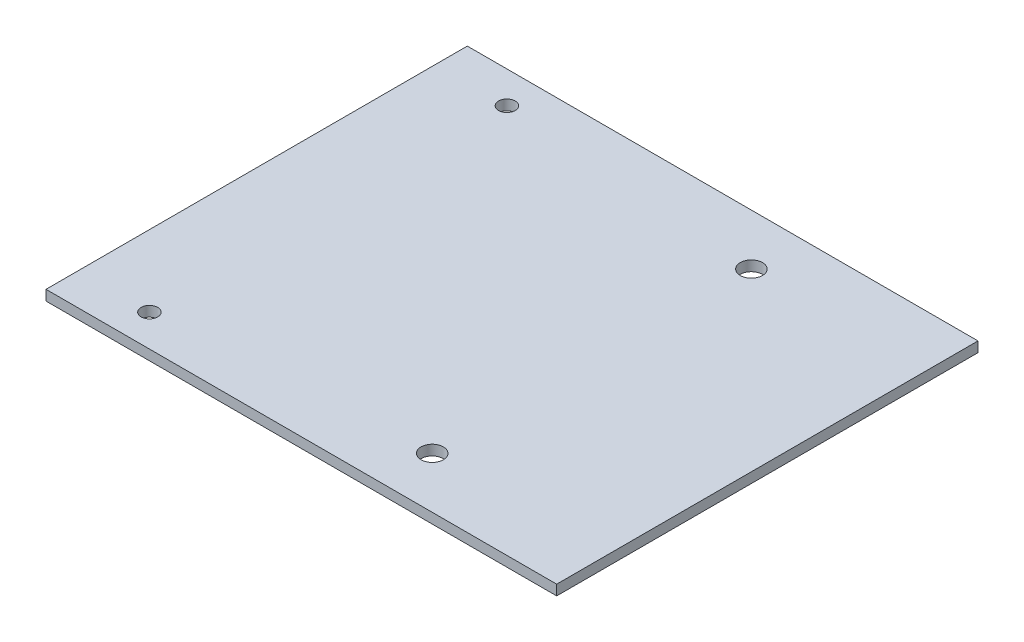
ISO-10303-21;
HEADER;
FILE_DESCRIPTION(('STEP AP214'),'2;1');
FILE_NAME('part.step','',(''),(''),'','','');
FILE_SCHEMA(('AUTOMOTIVE_DESIGN { 1 0 10303 214 1 1 1 1 }'));
ENDSEC;
DATA;
#1=APPLICATION_CONTEXT('core data for automotive mechanical design processes');
#2=APPLICATION_PROTOCOL_DEFINITION('international standard','automotive_design',2000,#1);
#3=PRODUCT_CONTEXT('',#1,'mechanical');
#4=PRODUCT('Part','Part','',(#3));
#5=PRODUCT_RELATED_PRODUCT_CATEGORY('part','',(#4));
#6=PRODUCT_DEFINITION_FORMATION('','',#4);
#7=PRODUCT_DEFINITION_CONTEXT('part definition',#1,'design');
#8=PRODUCT_DEFINITION('design','',#6,#7);
#9=PRODUCT_DEFINITION_SHAPE('','',#8);
#10=(LENGTH_UNIT() NAMED_UNIT(*) SI_UNIT(.MILLI.,.METRE.));
#11=(NAMED_UNIT(*) PLANE_ANGLE_UNIT() SI_UNIT($,.RADIAN.));
#12=(NAMED_UNIT(*) SI_UNIT($,.STERADIAN.) SOLID_ANGLE_UNIT());
#13=UNCERTAINTY_MEASURE_WITH_UNIT(LENGTH_MEASURE(1.E-05),#10,'distance_accuracy_value','');
#14=(GEOMETRIC_REPRESENTATION_CONTEXT(3) GLOBAL_UNCERTAINTY_ASSIGNED_CONTEXT((#13)) GLOBAL_UNIT_ASSIGNED_CONTEXT((#10,
#11,#12)) REPRESENTATION_CONTEXT('',''));
#15=CARTESIAN_POINT('',(0.,0.,0.));
#16=DIRECTION('',(0.,0.,1.));
#17=DIRECTION('',(1.,0.,0.));
#18=AXIS2_PLACEMENT_3D('',#15,#16,#17);
#19=CARTESIAN_POINT('',(40.,1.6,33.));
#20=DIRECTION('',(-1.,0.,0.));
#21=DIRECTION('',(0.,0.,1.));
#22=AXIS2_PLACEMENT_3D('',#19,#20,#21);
#23=PLANE('',#22);
#24=DIRECTION('',(0.,0.,-1.));
#25=VECTOR('',#24,1.);
#26=CARTESIAN_POINT('',(40.,0.,33.));
#27=LINE('',#26,#25);
#28=CARTESIAN_POINT('',(40.,0.,33.));
#29=VERTEX_POINT('',#28);
#30=CARTESIAN_POINT('',(40.,0.,-33.));
#31=VERTEX_POINT('',#30);
#32=EDGE_CURVE('E94',#29,#31,#27,.T.);
#33=ORIENTED_EDGE('',*,*,#32,.T.);
#34=DIRECTION('',(0.,-1.,0.));
#35=VECTOR('',#34,1.);
#36=CARTESIAN_POINT('',(40.,1.6,-33.));
#37=LINE('',#36,#35);
#38=CARTESIAN_POINT('',(40.,1.6,-33.));
#39=VERTEX_POINT('',#38);
#40=EDGE_CURVE('E11',#39,#31,#37,.T.);
#41=ORIENTED_EDGE('',*,*,#40,.F.);
#42=DIRECTION('',(0.,0.,-1.));
#43=VECTOR('',#42,1.);
#44=CARTESIAN_POINT('',(40.,1.6,33.));
#45=LINE('',#44,#43);
#46=CARTESIAN_POINT('',(40.,1.6,33.));
#47=VERTEX_POINT('',#46);
#48=EDGE_CURVE('E82',#47,#39,#45,.T.);
#49=ORIENTED_EDGE('',*,*,#48,.F.);
#50=DIRECTION('',(0.,-1.,0.));
#51=VECTOR('',#50,1.);
#52=CARTESIAN_POINT('',(40.,1.6,33.));
#53=LINE('',#52,#51);
#54=EDGE_CURVE('E90',#47,#29,#53,.T.);
#55=ORIENTED_EDGE('',*,*,#54,.T.);
#56=EDGE_LOOP('',(#33,#41,#49,#55));
#57=FACE_BOUND('',#56,.T.);
#58=ADVANCED_FACE('F31',(#57),#23,.F.);
#59=CARTESIAN_POINT('',(-40.,1.6,-33.));
#60=DIRECTION('',(0.,0.,1.));
#61=DIRECTION('',(1.,0.,0.));
#62=AXIS2_PLACEMENT_3D('',#59,#60,#61);
#63=PLANE('',#62);
#64=DIRECTION('',(-1.,0.,0.));
#65=VECTOR('',#64,1.);
#66=CARTESIAN_POINT('',(-40.,0.,-33.));
#67=LINE('',#66,#65);
#68=CARTESIAN_POINT('',(-40.,0.,-33.));
#69=VERTEX_POINT('',#68);
#70=EDGE_CURVE('E86',#31,#69,#67,.T.);
#71=ORIENTED_EDGE('',*,*,#70,.T.);
#72=DIRECTION('',(0.,-1.,0.));
#73=VECTOR('',#72,1.);
#74=CARTESIAN_POINT('',(-40.,1.6,-33.));
#75=LINE('',#74,#73);
#76=CARTESIAN_POINT('',(-40.,1.6,-33.));
#77=VERTEX_POINT('',#76);
#78=EDGE_CURVE('E39',#77,#69,#75,.T.);
#79=ORIENTED_EDGE('',*,*,#78,.F.);
#80=DIRECTION('',(-1.,0.,0.));
#81=VECTOR('',#80,1.);
#82=CARTESIAN_POINT('',(-40.,1.6,-33.));
#83=LINE('',#82,#81);
#84=EDGE_CURVE('E77',#39,#77,#83,.T.);
#85=ORIENTED_EDGE('',*,*,#84,.F.);
#86=ORIENTED_EDGE('',*,*,#40,.T.);
#87=EDGE_LOOP('',(#71,#79,#85,#86));
#88=FACE_BOUND('',#87,.T.);
#89=ADVANCED_FACE('F85',(#88),#63,.F.);
#90=CARTESIAN_POINT('',(-40.,1.6,33.));
#91=DIRECTION('',(1.,0.,0.));
#92=DIRECTION('',(0.,0.,-1.));
#93=AXIS2_PLACEMENT_3D('',#90,#91,#92);
#94=PLANE('',#93);
#95=DIRECTION('',(0.,0.,1.));
#96=VECTOR('',#95,1.);
#97=CARTESIAN_POINT('',(-40.,0.,33.));
#98=LINE('',#97,#96);
#99=CARTESIAN_POINT('',(-40.,0.,33.));
#100=VERTEX_POINT('',#99);
#101=EDGE_CURVE('E64',#69,#100,#98,.T.);
#102=ORIENTED_EDGE('',*,*,#101,.T.);
#103=DIRECTION('',(0.,-1.,0.));
#104=VECTOR('',#103,1.);
#105=CARTESIAN_POINT('',(-40.,1.6,33.));
#106=LINE('',#105,#104);
#107=CARTESIAN_POINT('',(-40.,1.6,33.));
#108=VERTEX_POINT('',#107);
#109=EDGE_CURVE('E87',#108,#100,#106,.T.);
#110=ORIENTED_EDGE('',*,*,#109,.F.);
#111=DIRECTION('',(0.,0.,1.));
#112=VECTOR('',#111,1.);
#113=CARTESIAN_POINT('',(-40.,1.6,33.));
#114=LINE('',#113,#112);
#115=EDGE_CURVE('E80',#77,#108,#114,.T.);
#116=ORIENTED_EDGE('',*,*,#115,.F.);
#117=ORIENTED_EDGE('',*,*,#78,.T.);
#118=EDGE_LOOP('',(#102,#110,#116,#117));
#119=FACE_BOUND('',#118,.T.);
#120=ADVANCED_FACE('F88',(#119),#94,.F.);
#121=CARTESIAN_POINT('',(-40.,1.6,33.));
#122=DIRECTION('',(0.,0.,-1.));
#123=DIRECTION('',(-1.,0.,0.));
#124=AXIS2_PLACEMENT_3D('',#121,#122,#123);
#125=PLANE('',#124);
#126=DIRECTION('',(1.,0.,0.));
#127=VECTOR('',#126,1.);
#128=CARTESIAN_POINT('',(-40.,0.,33.));
#129=LINE('',#128,#127);
#130=EDGE_CURVE('E70',#100,#29,#129,.T.);
#131=ORIENTED_EDGE('',*,*,#130,.T.);
#132=ORIENTED_EDGE('',*,*,#54,.F.);
#133=DIRECTION('',(1.,0.,0.));
#134=VECTOR('',#133,1.);
#135=CARTESIAN_POINT('',(-40.,1.6,33.));
#136=LINE('',#135,#134);
#137=EDGE_CURVE('E47',#108,#47,#136,.T.);
#138=ORIENTED_EDGE('',*,*,#137,.F.);
#139=ORIENTED_EDGE('',*,*,#109,.T.);
#140=EDGE_LOOP('',(#131,#132,#138,#139));
#141=FACE_BOUND('',#140,.T.);
#142=ADVANCED_FACE('F102',(#141),#125,.F.);
#143=CARTESIAN_POINT('',(40.,1.6,-33.));
#144=DIRECTION('',(0.,-1.,0.));
#145=DIRECTION('',(0.,0.,-1.));
#146=AXIS2_PLACEMENT_3D('',#143,#144,#145);
#147=PLANE('',#146);
#148=CARTESIAN_POINT('',(12.5,1.6,25.));
#149=DIRECTION('',(0.,1.,0.));
#150=DIRECTION('',(0.,0.,1.));
#151=AXIS2_PLACEMENT_3D('',#148,#149,#150);
#152=CIRCLE('',#151,1.75);
#153=CARTESIAN_POINT('',(12.5,1.6,26.75));
#154=VERTEX_POINT('',#153);
#155=EDGE_CURVE('E123',#154,#154,#152,.T.);
#156=ORIENTED_EDGE('',*,*,#155,.F.);
#157=EDGE_LOOP('',(#156));
#158=FACE_BOUND('',#157,.T.);
#159=CARTESIAN_POINT('',(12.5,1.6,-25.));
#160=DIRECTION('',(0.,1.,0.));
#161=DIRECTION('',(0.,0.,1.));
#162=AXIS2_PLACEMENT_3D('',#159,#160,#161);
#163=CIRCLE('',#162,1.75);
#164=CARTESIAN_POINT('',(12.5,1.6,-23.25));
#165=VERTEX_POINT('',#164);
#166=EDGE_CURVE('E117',#165,#165,#163,.T.);
#167=ORIENTED_EDGE('',*,*,#166,.F.);
#168=EDGE_LOOP('',(#167));
#169=FACE_BOUND('',#168,.T.);
#170=CARTESIAN_POINT('',(-28.802,1.6,28.));
#171=DIRECTION('',(0.,1.,0.));
#172=DIRECTION('',(0.,0.,1.));
#173=AXIS2_PLACEMENT_3D('',#170,#171,#172);
#174=CIRCLE('',#173,1.3);
#175=CARTESIAN_POINT('',(-28.802,1.6,29.3));
#176=VERTEX_POINT('',#175);
#177=EDGE_CURVE('E114',#176,#176,#174,.T.);
#178=ORIENTED_EDGE('',*,*,#177,.F.);
#179=EDGE_LOOP('',(#178));
#180=FACE_BOUND('',#179,.T.);
#181=CARTESIAN_POINT('',(-28.802,1.6,-28.));
#182=DIRECTION('',(0.,1.,0.));
#183=DIRECTION('',(0.,0.,1.));
#184=AXIS2_PLACEMENT_3D('',#181,#182,#183);
#185=CIRCLE('',#184,1.3);
#186=CARTESIAN_POINT('',(-28.802,1.6,-26.7));
#187=VERTEX_POINT('',#186);
#188=EDGE_CURVE('E108',#187,#187,#185,.T.);
#189=ORIENTED_EDGE('',*,*,#188,.F.);
#190=EDGE_LOOP('',(#189));
#191=FACE_BOUND('',#190,.T.);
#192=ORIENTED_EDGE('',*,*,#48,.T.);
#193=ORIENTED_EDGE('',*,*,#84,.T.);
#194=ORIENTED_EDGE('',*,*,#115,.T.);
#195=ORIENTED_EDGE('',*,*,#137,.T.);
#196=EDGE_LOOP('',(#192,#193,#194,#195));
#197=FACE_BOUND('',#196,.T.);
#198=ADVANCED_FACE('F78',(#158,#169,#180,#191,#197),#147,.F.);
#199=CARTESIAN_POINT('',(40.,0.,-33.));
#200=DIRECTION('',(0.,-1.,0.));
#201=DIRECTION('',(0.,0.,-1.));
#202=AXIS2_PLACEMENT_3D('',#199,#200,#201);
#203=PLANE('',#202);
#204=CARTESIAN_POINT('',(12.5,0.,25.));
#205=DIRECTION('',(0.,-1.,0.));
#206=DIRECTION('',(0.,0.,-1.));
#207=AXIS2_PLACEMENT_3D('',#204,#205,#206);
#208=CIRCLE('',#207,1.75);
#209=CARTESIAN_POINT('',(12.5,0.,23.25));
#210=VERTEX_POINT('',#209);
#211=EDGE_CURVE('E126',#210,#210,#208,.F.);
#212=ORIENTED_EDGE('',*,*,#211,.T.);
#213=EDGE_LOOP('',(#212));
#214=FACE_BOUND('',#213,.T.);
#215=CARTESIAN_POINT('',(12.5,0.,-25.));
#216=DIRECTION('',(0.,-1.,0.));
#217=DIRECTION('',(0.,0.,-1.));
#218=AXIS2_PLACEMENT_3D('',#215,#216,#217);
#219=CIRCLE('',#218,1.75);
#220=CARTESIAN_POINT('',(12.5,0.,-26.75));
#221=VERTEX_POINT('',#220);
#222=EDGE_CURVE('E120',#221,#221,#219,.F.);
#223=ORIENTED_EDGE('',*,*,#222,.T.);
#224=EDGE_LOOP('',(#223));
#225=FACE_BOUND('',#224,.T.);
#226=CARTESIAN_POINT('',(-28.802,0.,28.));
#227=DIRECTION('',(0.,1.,0.));
#228=DIRECTION('',(0.,0.,1.));
#229=AXIS2_PLACEMENT_3D('',#226,#227,#228);
#230=CIRCLE('',#229,1.3);
#231=CARTESIAN_POINT('',(-28.802,0.,29.3));
#232=VERTEX_POINT('',#231);
#233=EDGE_CURVE('E111',#232,#232,#230,.T.);
#234=ORIENTED_EDGE('',*,*,#233,.T.);
#235=EDGE_LOOP('',(#234));
#236=FACE_BOUND('',#235,.T.);
#237=CARTESIAN_POINT('',(-28.802,0.,-28.));
#238=DIRECTION('',(0.,1.,0.));
#239=DIRECTION('',(0.,0.,1.));
#240=AXIS2_PLACEMENT_3D('',#237,#238,#239);
#241=CIRCLE('',#240,1.3);
#242=CARTESIAN_POINT('',(-28.802,0.,-26.7));
#243=VERTEX_POINT('',#242);
#244=EDGE_CURVE('E97',#243,#243,#241,.T.);
#245=ORIENTED_EDGE('',*,*,#244,.T.);
#246=EDGE_LOOP('',(#245));
#247=FACE_BOUND('',#246,.T.);
#248=ORIENTED_EDGE('',*,*,#32,.F.);
#249=ORIENTED_EDGE('',*,*,#130,.F.);
#250=ORIENTED_EDGE('',*,*,#101,.F.);
#251=ORIENTED_EDGE('',*,*,#70,.F.);
#252=EDGE_LOOP('',(#248,#249,#250,#251));
#253=FACE_BOUND('',#252,.T.);
#254=ADVANCED_FACE('F105',(#214,#225,#236,#247,#253),#203,.T.);
#255=CARTESIAN_POINT('',(-28.802,0.,-28.));
#256=DIRECTION('',(0.,1.,0.));
#257=DIRECTION('',(0.,0.,1.));
#258=AXIS2_PLACEMENT_3D('',#255,#256,#257);
#259=CYLINDRICAL_SURFACE('',#258,1.3);
#260=ORIENTED_EDGE('',*,*,#244,.F.);
#261=EDGE_LOOP('',(#260));
#262=FACE_BOUND('',#261,.T.);
#263=ORIENTED_EDGE('',*,*,#188,.T.);
#264=EDGE_LOOP('',(#263));
#265=FACE_BOUND('',#264,.T.);
#266=ADVANCED_FACE('F143',(#262,#265),#259,.F.);
#267=CARTESIAN_POINT('',(-28.802,0.,28.));
#268=DIRECTION('',(0.,1.,0.));
#269=DIRECTION('',(0.,0.,1.));
#270=AXIS2_PLACEMENT_3D('',#267,#268,#269);
#271=CYLINDRICAL_SURFACE('',#270,1.3);
#272=ORIENTED_EDGE('',*,*,#233,.F.);
#273=EDGE_LOOP('',(#272));
#274=FACE_BOUND('',#273,.T.);
#275=ORIENTED_EDGE('',*,*,#177,.T.);
#276=EDGE_LOOP('',(#275));
#277=FACE_BOUND('',#276,.T.);
#278=ADVANCED_FACE('F145',(#274,#277),#271,.F.);
#279=CARTESIAN_POINT('',(12.5,-0.000999999999999916,-25.));
#280=DIRECTION('',(0.,1.,0.));
#281=DIRECTION('',(0.,0.,1.));
#282=AXIS2_PLACEMENT_3D('',#279,#280,#281);
#283=CYLINDRICAL_SURFACE('',#282,1.75);
#284=ORIENTED_EDGE('',*,*,#222,.F.);
#285=EDGE_LOOP('',(#284));
#286=FACE_BOUND('',#285,.T.);
#287=ORIENTED_EDGE('',*,*,#166,.T.);
#288=EDGE_LOOP('',(#287));
#289=FACE_BOUND('',#288,.T.);
#290=ADVANCED_FACE('F152',(#286,#289),#283,.F.);
#291=CARTESIAN_POINT('',(12.5,-0.000999999999999916,25.));
#292=DIRECTION('',(0.,1.,0.));
#293=DIRECTION('',(0.,0.,1.));
#294=AXIS2_PLACEMENT_3D('',#291,#292,#293);
#295=CYLINDRICAL_SURFACE('',#294,1.75);
#296=ORIENTED_EDGE('',*,*,#211,.F.);
#297=EDGE_LOOP('',(#296));
#298=FACE_BOUND('',#297,.T.);
#299=ORIENTED_EDGE('',*,*,#155,.T.);
#300=EDGE_LOOP('',(#299));
#301=FACE_BOUND('',#300,.T.);
#302=ADVANCED_FACE('F132',(#298,#301),#295,.F.);
#303=CLOSED_SHELL('',(#58,#89,#120,#142,#198,#254,#266,#278,#290,#302));
#304=MANIFOLD_SOLID_BREP('B2',#303);
#305=ADVANCED_BREP_SHAPE_REPRESENTATION('',(#18,#304),#14);
#306=SHAPE_DEFINITION_REPRESENTATION(#9,#305);
ENDSEC;
END-ISO-10303-21;
